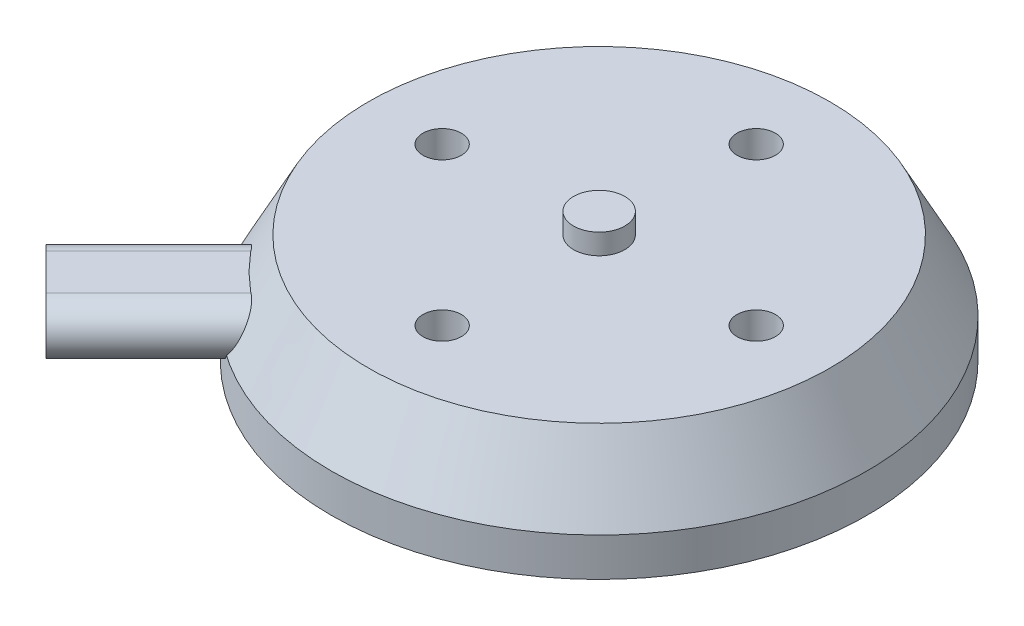
ISO-10303-21;
HEADER;
FILE_DESCRIPTION(('STEP AP214'),'2;1');
FILE_NAME('part.step','',(''),(''),'','','');
FILE_SCHEMA(('AUTOMOTIVE_DESIGN { 1 0 10303 214 1 1 1 1 }'));
ENDSEC;
DATA;
#1=APPLICATION_CONTEXT('core data for automotive mechanical design processes');
#2=APPLICATION_PROTOCOL_DEFINITION('international standard','automotive_design',2000,#1);
#3=PRODUCT_CONTEXT('',#1,'mechanical');
#4=PRODUCT('Part','Part','',(#3));
#5=PRODUCT_RELATED_PRODUCT_CATEGORY('part','',(#4));
#6=PRODUCT_DEFINITION_FORMATION('','',#4);
#7=PRODUCT_DEFINITION_CONTEXT('part definition',#1,'design');
#8=PRODUCT_DEFINITION('design','',#6,#7);
#9=PRODUCT_DEFINITION_SHAPE('','',#8);
#10=(LENGTH_UNIT() NAMED_UNIT(*) SI_UNIT(.MILLI.,.METRE.));
#11=(NAMED_UNIT(*) PLANE_ANGLE_UNIT() SI_UNIT($,.RADIAN.));
#12=(NAMED_UNIT(*) SI_UNIT($,.STERADIAN.) SOLID_ANGLE_UNIT());
#13=UNCERTAINTY_MEASURE_WITH_UNIT(LENGTH_MEASURE(1.E-05),#10,'distance_accuracy_value','');
#14=(GEOMETRIC_REPRESENTATION_CONTEXT(3) GLOBAL_UNCERTAINTY_ASSIGNED_CONTEXT((#13)) GLOBAL_UNIT_ASSIGNED_CONTEXT((#10,
#11,#12)) REPRESENTATION_CONTEXT('',''));
#15=CARTESIAN_POINT('',(0.,0.,0.));
#16=DIRECTION('',(0.,0.,1.));
#17=DIRECTION('',(1.,0.,0.));
#18=AXIS2_PLACEMENT_3D('',#15,#16,#17);
#19=CARTESIAN_POINT('',(-1.4142135623731,4.,-1.41421356237309));
#20=DIRECTION('',(-0.707106781186544,0.,0.707106781186551));
#21=DIRECTION('',(0.707106781186551,0.,0.707106781186544));
#22=AXIS2_PLACEMENT_3D('',#19,#20,#21);
#23=CYLINDRICAL_SURFACE('',#22,2.);
#24=DIRECTION('',(-0.707106781186544,0.,0.707106781186551));
#25=VECTOR('',#24,1.);
#26=CARTESIAN_POINT('',(-1.41421356237311,6.,-1.41421356237309));
#27=LINE('',#26,#25);
#28=CARTESIAN_POINT('',(-1.4142135623731,6.,-1.41421356237309));
#29=VERTEX_POINT('',#28);
#30=CARTESIAN_POINT('',(-22.9906252171124,6.,20.1621980923664));
#31=VERTEX_POINT('',#30);
#32=EDGE_CURVE('E101',#29,#31,#27,.T.);
#33=ORIENTED_EDGE('',*,*,#32,.F.);
#34=CARTESIAN_POINT('',(-1.4142135623731,4.,-1.41421356237309));
#35=DIRECTION('',(0.707106781186544,0.,-0.707106781186551));
#36=DIRECTION('',(-0.707106781186551,0.,-0.707106781186544));
#37=AXIS2_PLACEMENT_3D('',#34,#35,#36);
#38=CIRCLE('',#37,2.);
#39=CARTESIAN_POINT('',(-1.4142135623731,2.,-1.41421356237309));
#40=VERTEX_POINT('',#39);
#41=EDGE_CURVE('E53',#40,#29,#38,.T.);
#42=ORIENTED_EDGE('',*,*,#41,.F.);
#43=DIRECTION('',(0.707106781186544,0.,-0.707106781186551));
#44=VECTOR('',#43,1.);
#45=CARTESIAN_POINT('',(-1.4142135623731,2.,-1.41421356237309));
#46=LINE('',#45,#44);
#47=CARTESIAN_POINT('',(-22.9906252171124,2.,20.1621980923664));
#48=VERTEX_POINT('',#47);
#49=EDGE_CURVE('E114',#48,#40,#46,.T.);
#50=ORIENTED_EDGE('',*,*,#49,.F.);
#51=CARTESIAN_POINT('',(-22.9906252171124,4.,20.1621980923664));
#52=DIRECTION('',(0.707106781186544,0.,-0.707106781186552));
#53=DIRECTION('',(-0.707106781186551,0.,-0.707106781186544));
#54=AXIS2_PLACEMENT_3D('',#51,#52,#53);
#55=CIRCLE('',#54,2.);
#56=EDGE_CURVE('E12',#31,#48,#55,.F.);
#57=ORIENTED_EDGE('',*,*,#56,.F.);
#58=EDGE_LOOP('',(#33,#42,#50,#57));
#59=FACE_BOUND('',#58,.T.);
#60=ADVANCED_FACE('F45',(#59),#23,.T.);
#61=CARTESIAN_POINT('',(-20.1621980923662,4.,22.9906252171126));
#62=DIRECTION('',(0.707106781186544,0.,-0.707106781186551));
#63=DIRECTION('',(-0.707106781186551,0.,-0.707106781186544));
#64=AXIS2_PLACEMENT_3D('',#61,#62,#63);
#65=CYLINDRICAL_SURFACE('',#64,2.);
#66=DIRECTION('',(0.707106781186544,0.,-0.707106781186551));
#67=VECTOR('',#66,1.);
#68=CARTESIAN_POINT('',(1.41421356237312,6.,1.4142135623731));
#69=LINE('',#68,#67);
#70=CARTESIAN_POINT('',(-20.1621980923662,6.,22.9906252171126));
#71=VERTEX_POINT('',#70);
#72=CARTESIAN_POINT('',(1.41421356237312,6.,1.4142135623731));
#73=VERTEX_POINT('',#72);
#74=EDGE_CURVE('E92',#71,#73,#69,.T.);
#75=ORIENTED_EDGE('',*,*,#74,.F.);
#76=CARTESIAN_POINT('',(-20.1621980923662,4.,22.9906252171126));
#77=DIRECTION('',(0.707106781186544,0.,-0.707106781186552));
#78=DIRECTION('',(-0.707106781186551,0.,-0.707106781186544));
#79=AXIS2_PLACEMENT_3D('',#76,#77,#78);
#80=CIRCLE('',#79,2.);
#81=CARTESIAN_POINT('',(-20.1621980923662,2.,22.9906252171126));
#82=VERTEX_POINT('',#81);
#83=EDGE_CURVE('E102',#82,#71,#80,.F.);
#84=ORIENTED_EDGE('',*,*,#83,.F.);
#85=DIRECTION('',(-0.707106781186544,0.,0.707106781186551));
#86=VECTOR('',#85,1.);
#87=CARTESIAN_POINT('',(-20.1621980923662,2.,22.9906252171126));
#88=LINE('',#87,#86);
#89=CARTESIAN_POINT('',(1.41421356237312,2.,1.4142135623731));
#90=VERTEX_POINT('',#89);
#91=EDGE_CURVE('E100',#90,#82,#88,.T.);
#92=ORIENTED_EDGE('',*,*,#91,.F.);
#93=CARTESIAN_POINT('',(1.41421356237312,4.,1.4142135623731));
#94=DIRECTION('',(0.707106781186544,0.,-0.707106781186551));
#95=DIRECTION('',(-0.707106781186551,0.,-0.707106781186544));
#96=AXIS2_PLACEMENT_3D('',#93,#94,#95);
#97=CIRCLE('',#96,2.);
#98=EDGE_CURVE('E87',#73,#90,#97,.T.);
#99=ORIENTED_EDGE('',*,*,#98,.F.);
#100=EDGE_LOOP('',(#75,#84,#92,#99));
#101=FACE_BOUND('',#100,.T.);
#102=ADVANCED_FACE('F97',(#101),#65,.T.);
#103=CARTESIAN_POINT('',(0.,6.,0.));
#104=DIRECTION('',(0.707106781186544,0.,-0.707106781186551));
#105=DIRECTION('',(-0.707106781186551,0.,-0.707106781186544));
#106=AXIS2_PLACEMENT_3D('',#103,#104,#105);
#107=PLANE('',#106);
#108=DIRECTION('',(0.707106781186551,0.,0.707106781186544));
#109=VECTOR('',#108,1.);
#110=CARTESIAN_POINT('',(0.,2.,0.));
#111=LINE('',#110,#109);
#112=EDGE_CURVE('E109',#40,#90,#111,.T.);
#113=ORIENTED_EDGE('',*,*,#112,.F.);
#114=ORIENTED_EDGE('',*,*,#41,.T.);
#115=DIRECTION('',(0.707106781186551,0.,0.707106781186544));
#116=VECTOR('',#115,1.);
#117=CARTESIAN_POINT('',(0.,6.,0.));
#118=LINE('',#117,#116);
#119=EDGE_CURVE('E83',#29,#73,#118,.T.);
#120=ORIENTED_EDGE('',*,*,#119,.T.);
#121=ORIENTED_EDGE('',*,*,#98,.T.);
#122=EDGE_LOOP('',(#113,#114,#120,#121));
#123=FACE_BOUND('',#122,.T.);
#124=ADVANCED_FACE('F86',(#123),#107,.T.);
#125=CARTESIAN_POINT('',(-21.5764116547393,6.,21.5764116547395));
#126=DIRECTION('',(0.707106781186544,0.,-0.707106781186552));
#127=DIRECTION('',(-0.707106781186551,0.,-0.707106781186544));
#128=AXIS2_PLACEMENT_3D('',#125,#126,#127);
#129=PLANE('',#128);
#130=DIRECTION('',(0.707106781186551,0.,0.707106781186544));
#131=VECTOR('',#130,1.);
#132=CARTESIAN_POINT('',(-21.5764116547393,6.,21.5764116547395));
#133=LINE('',#132,#131);
#134=EDGE_CURVE('E93',#31,#71,#133,.T.);
#135=ORIENTED_EDGE('',*,*,#134,.F.);
#136=ORIENTED_EDGE('',*,*,#56,.T.);
#137=DIRECTION('',(0.707106781186551,0.,0.707106781186544));
#138=VECTOR('',#137,1.);
#139=CARTESIAN_POINT('',(-21.5764116547393,2.,21.5764116547395));
#140=LINE('',#139,#138);
#141=EDGE_CURVE('E118',#48,#82,#140,.T.);
#142=ORIENTED_EDGE('',*,*,#141,.T.);
#143=ORIENTED_EDGE('',*,*,#83,.T.);
#144=EDGE_LOOP('',(#135,#136,#142,#143));
#145=FACE_BOUND('',#144,.T.);
#146=ADVANCED_FACE('F120',(#145),#129,.F.);
#147=CARTESIAN_POINT('',(0.,6.,0.));
#148=DIRECTION('',(0.,-1.,0.));
#149=DIRECTION('',(0.,0.,-1.));
#150=AXIS2_PLACEMENT_3D('',#147,#148,#149);
#151=PLANE('',#150);
#152=ORIENTED_EDGE('',*,*,#119,.F.);
#153=ORIENTED_EDGE('',*,*,#32,.T.);
#154=ORIENTED_EDGE('',*,*,#134,.T.);
#155=ORIENTED_EDGE('',*,*,#74,.T.);
#156=EDGE_LOOP('',(#152,#153,#154,#155));
#157=FACE_BOUND('',#156,.T.);
#158=ADVANCED_FACE('F104',(#157),#151,.F.);
#159=CARTESIAN_POINT('',(0.,2.,0.));
#160=DIRECTION('',(0.,-1.,0.));
#161=DIRECTION('',(0.,0.,-1.));
#162=AXIS2_PLACEMENT_3D('',#159,#160,#161);
#163=PLANE('',#162);
#164=ORIENTED_EDGE('',*,*,#141,.F.);
#165=ORIENTED_EDGE('',*,*,#49,.T.);
#166=ORIENTED_EDGE('',*,*,#112,.T.);
#167=ORIENTED_EDGE('',*,*,#91,.T.);
#168=EDGE_LOOP('',(#164,#165,#166,#167));
#169=FACE_BOUND('',#168,.T.);
#170=ADVANCED_FACE('F117',(#169),#163,.T.);
#171=CLOSED_SHELL('',(#60,#102,#124,#146,#158,#170));
#172=MANIFOLD_SOLID_BREP('B2',#171);
#173=CARTESIAN_POINT('',(0.,10.1,0.));
#174=DIRECTION('',(0.,-1.,0.));
#175=DIRECTION('',(0.,0.,-1.));
#176=AXIS2_PLACEMENT_3D('',#173,#174,#175);
#177=CYLINDRICAL_SURFACE('',#176,2.);
#178=CARTESIAN_POINT('',(0.,10.1,0.));
#179=DIRECTION('',(0.,1.,0.));
#180=DIRECTION('',(0.,0.,1.));
#181=AXIS2_PLACEMENT_3D('',#178,#179,#180);
#182=CIRCLE('',#181,2.);
#183=CARTESIAN_POINT('',(0.,10.1,2.));
#184=VERTEX_POINT('',#183);
#185=EDGE_CURVE('E44',#184,#184,#182,.T.);
#186=ORIENTED_EDGE('',*,*,#185,.F.);
#187=EDGE_LOOP('',(#186));
#188=FACE_BOUND('',#187,.T.);
#189=CARTESIAN_POINT('',(0.,8.5,0.));
#190=DIRECTION('',(0.,1.,0.));
#191=DIRECTION('',(0.,0.,1.));
#192=AXIS2_PLACEMENT_3D('',#189,#190,#191);
#193=CIRCLE('',#192,2.);
#194=CARTESIAN_POINT('',(0.,8.5,2.));
#195=VERTEX_POINT('',#194);
#196=EDGE_CURVE('E199',#195,#195,#193,.T.);
#197=ORIENTED_EDGE('',*,*,#196,.T.);
#198=EDGE_LOOP('',(#197));
#199=FACE_BOUND('',#198,.T.);
#200=ADVANCED_FACE('F196',(#188,#199),#177,.T.);
#201=CARTESIAN_POINT('',(0.,10.1,0.));
#202=DIRECTION('',(0.,1.,0.));
#203=DIRECTION('',(0.,0.,1.));
#204=AXIS2_PLACEMENT_3D('',#201,#202,#203);
#205=PLANE('',#204);
#206=ORIENTED_EDGE('',*,*,#185,.T.);
#207=EDGE_LOOP('',(#206));
#208=FACE_BOUND('',#207,.T.);
#209=ADVANCED_FACE('F211',(#208),#205,.T.);
#210=CARTESIAN_POINT('',(0.,8.5,0.));
#211=DIRECTION('',(0.,1.,0.));
#212=DIRECTION('',(0.,0.,1.));
#213=AXIS2_PLACEMENT_3D('',#210,#211,#212);
#214=PLANE('',#213);
#215=ORIENTED_EDGE('',*,*,#196,.F.);
#216=EDGE_LOOP('',(#215));
#217=FACE_BOUND('',#216,.T.);
#218=ADVANCED_FACE('F209',(#217),#214,.F.);
#219=CLOSED_SHELL('',(#200,#209,#218));
#220=MANIFOLD_SOLID_BREP('B6',#219);
#221=CARTESIAN_POINT('',(-18.,8.5,0.));
#222=DIRECTION('',(0.,-1.,0.));
#223=DIRECTION('',(0.,0.,-1.));
#224=AXIS2_PLACEMENT_3D('',#221,#222,#223);
#225=PLANE('',#224);
#226=CARTESIAN_POINT('',(-1.31838984174237E-13,8.5,-12.25));
#227=DIRECTION('',(0.,1.,0.));
#228=DIRECTION('',(0.,0.,-1.));
#229=AXIS2_PLACEMENT_3D('',#226,#227,#228);
#230=CIRCLE('',#229,1.5);
#231=CARTESIAN_POINT('',(-1.31838984174237E-13,8.5,-13.75));
#232=VERTEX_POINT('',#231);
#233=EDGE_CURVE('E273',#232,#232,#230,.T.);
#234=ORIENTED_EDGE('',*,*,#233,.F.);
#235=EDGE_LOOP('',(#234));
#236=FACE_BOUND('',#235,.T.);
#237=CARTESIAN_POINT('',(1.33573707650214E-13,8.5,12.25));
#238=DIRECTION('',(0.,1.,0.));
#239=DIRECTION('',(0.,0.,-1.));
#240=AXIS2_PLACEMENT_3D('',#237,#238,#239);
#241=CIRCLE('',#240,1.5);
#242=CARTESIAN_POINT('',(1.33573707650214E-13,8.5,10.75));
#243=VERTEX_POINT('',#242);
#244=EDGE_CURVE('E267',#243,#243,#241,.T.);
#245=ORIENTED_EDGE('',*,*,#244,.F.);
#246=EDGE_LOOP('',(#245));
#247=FACE_BOUND('',#246,.T.);
#248=CARTESIAN_POINT('',(-12.25,8.5,0.));
#249=DIRECTION('',(0.,1.,0.));
#250=DIRECTION('',(0.,0.,1.));
#251=AXIS2_PLACEMENT_3D('',#248,#249,#250);
#252=CIRCLE('',#251,1.5);
#253=CARTESIAN_POINT('',(-12.25,8.5,1.5));
#254=VERTEX_POINT('',#253);
#255=EDGE_CURVE('E261',#254,#254,#252,.T.);
#256=ORIENTED_EDGE('',*,*,#255,.F.);
#257=EDGE_LOOP('',(#256));
#258=FACE_BOUND('',#257,.T.);
#259=CARTESIAN_POINT('',(12.25,8.5,0.));
#260=DIRECTION('',(0.,1.,0.));
#261=DIRECTION('',(0.,0.,1.));
#262=AXIS2_PLACEMENT_3D('',#259,#260,#261);
#263=CIRCLE('',#262,1.5);
#264=CARTESIAN_POINT('',(12.25,8.5,1.5));
#265=VERTEX_POINT('',#264);
#266=EDGE_CURVE('E255',#265,#265,#263,.T.);
#267=ORIENTED_EDGE('',*,*,#266,.F.);
#268=EDGE_LOOP('',(#267));
#269=FACE_BOUND('',#268,.T.);
#270=CARTESIAN_POINT('',(0.,8.5,0.));
#271=DIRECTION('',(0.,-1.,0.));
#272=DIRECTION('',(0.,0.,-1.));
#273=AXIS2_PLACEMENT_3D('',#270,#271,#272);
#274=CIRCLE('',#273,18.);
#275=CARTESIAN_POINT('',(0.,8.5,-18.));
#276=VERTEX_POINT('',#275);
#277=EDGE_CURVE('E195',#276,#276,#274,.T.);
#278=ORIENTED_EDGE('',*,*,#277,.F.);
#279=EDGE_LOOP('',(#278));
#280=FACE_BOUND('',#279,.T.);
#281=ADVANCED_FACE('F236',(#236,#247,#258,#269,#280),#225,.F.);
#282=CARTESIAN_POINT('',(0.,8.5,0.));
#283=DIRECTION('',(0.,-1.,0.));
#284=DIRECTION('',(0.,0.,-1.));
#285=AXIS2_PLACEMENT_3D('',#282,#283,#284);
#286=CONICAL_SURFACE('',#285,18.,0.485226992567336);
#287=CARTESIAN_POINT('',(0.,3.,0.));
#288=DIRECTION('',(0.,-1.,0.));
#289=DIRECTION('',(0.,0.,-1.));
#290=AXIS2_PLACEMENT_3D('',#287,#288,#289);
#291=CIRCLE('',#290,20.9);
#292=CARTESIAN_POINT('',(0.,3.,-20.9));
#293=VERTEX_POINT('',#292);
#294=EDGE_CURVE('E242',#293,#293,#291,.T.);
#295=ORIENTED_EDGE('',*,*,#294,.F.);
#296=EDGE_LOOP('',(#295));
#297=FACE_BOUND('',#296,.T.);
#298=ORIENTED_EDGE('',*,*,#277,.T.);
#299=EDGE_LOOP('',(#298));
#300=FACE_BOUND('',#299,.T.);
#301=ADVANCED_FACE('F282',(#297,#300),#286,.T.);
#302=CARTESIAN_POINT('',(0.,0.,0.));
#303=DIRECTION('',(0.,-1.,0.));
#304=DIRECTION('',(0.,0.,-1.));
#305=AXIS2_PLACEMENT_3D('',#302,#303,#304);
#306=CYLINDRICAL_SURFACE('',#305,20.9);
#307=CARTESIAN_POINT('',(0.,0.,0.));
#308=DIRECTION('',(0.,-1.,0.));
#309=DIRECTION('',(0.,0.,-1.));
#310=AXIS2_PLACEMENT_3D('',#307,#308,#309);
#311=CIRCLE('',#310,20.9);
#312=CARTESIAN_POINT('',(0.,0.,-20.9));
#313=VERTEX_POINT('',#312);
#314=EDGE_CURVE('E246',#313,#313,#311,.T.);
#315=ORIENTED_EDGE('',*,*,#314,.F.);
#316=EDGE_LOOP('',(#315));
#317=FACE_BOUND('',#316,.T.);
#318=ORIENTED_EDGE('',*,*,#294,.T.);
#319=EDGE_LOOP('',(#318));
#320=FACE_BOUND('',#319,.T.);
#321=ADVANCED_FACE('F300',(#317,#320),#306,.T.);
#322=CARTESIAN_POINT('',(-20.9,0.,0.));
#323=DIRECTION('',(0.,1.,0.));
#324=DIRECTION('',(0.,0.,1.));
#325=AXIS2_PLACEMENT_3D('',#322,#323,#324);
#326=PLANE('',#325);
#327=CARTESIAN_POINT('',(-1.31838984174237E-13,0.,-12.25));
#328=DIRECTION('',(0.,1.,0.));
#329=DIRECTION('',(0.,0.,1.));
#330=AXIS2_PLACEMENT_3D('',#327,#328,#329);
#331=CIRCLE('',#330,1.5);
#332=CARTESIAN_POINT('',(-1.31838984174237E-13,0.,-10.75));
#333=VERTEX_POINT('',#332);
#334=EDGE_CURVE('E270',#333,#333,#331,.F.);
#335=ORIENTED_EDGE('',*,*,#334,.F.);
#336=EDGE_LOOP('',(#335));
#337=FACE_BOUND('',#336,.T.);
#338=CARTESIAN_POINT('',(1.33573707650214E-13,0.,12.25));
#339=DIRECTION('',(0.,1.,0.));
#340=DIRECTION('',(0.,0.,1.));
#341=AXIS2_PLACEMENT_3D('',#338,#339,#340);
#342=CIRCLE('',#341,1.5);
#343=CARTESIAN_POINT('',(1.33573707650214E-13,0.,13.75));
#344=VERTEX_POINT('',#343);
#345=EDGE_CURVE('E264',#344,#344,#342,.F.);
#346=ORIENTED_EDGE('',*,*,#345,.F.);
#347=EDGE_LOOP('',(#346));
#348=FACE_BOUND('',#347,.T.);
#349=CARTESIAN_POINT('',(-12.25,0.,0.));
#350=DIRECTION('',(0.,1.,0.));
#351=DIRECTION('',(0.,0.,1.));
#352=AXIS2_PLACEMENT_3D('',#349,#350,#351);
#353=CIRCLE('',#352,1.5);
#354=CARTESIAN_POINT('',(-12.25,0.,1.5));
#355=VERTEX_POINT('',#354);
#356=EDGE_CURVE('E258',#355,#355,#353,.F.);
#357=ORIENTED_EDGE('',*,*,#356,.F.);
#358=EDGE_LOOP('',(#357));
#359=FACE_BOUND('',#358,.T.);
#360=CARTESIAN_POINT('',(12.25,0.,0.));
#361=DIRECTION('',(0.,1.,0.));
#362=DIRECTION('',(0.,0.,1.));
#363=AXIS2_PLACEMENT_3D('',#360,#361,#362);
#364=CIRCLE('',#363,1.5);
#365=CARTESIAN_POINT('',(12.25,0.,1.5));
#366=VERTEX_POINT('',#365);
#367=EDGE_CURVE('E250',#366,#366,#364,.F.);
#368=ORIENTED_EDGE('',*,*,#367,.F.);
#369=EDGE_LOOP('',(#368));
#370=FACE_BOUND('',#369,.T.);
#371=ORIENTED_EDGE('',*,*,#314,.T.);
#372=EDGE_LOOP('',(#371));
#373=FACE_BOUND('',#372,.T.);
#374=ADVANCED_FACE('F294',(#337,#348,#359,#370,#373),#326,.F.);
#375=CARTESIAN_POINT('',(12.25,-0.000999999999999265,0.));
#376=DIRECTION('',(0.,1.,0.));
#377=DIRECTION('',(0.,0.,1.));
#378=AXIS2_PLACEMENT_3D('',#375,#376,#377);
#379=CYLINDRICAL_SURFACE('',#378,1.5);
#380=ORIENTED_EDGE('',*,*,#266,.T.);
#381=EDGE_LOOP('',(#380));
#382=FACE_BOUND('',#381,.T.);
#383=ORIENTED_EDGE('',*,*,#367,.T.);
#384=EDGE_LOOP('',(#383));
#385=FACE_BOUND('',#384,.T.);
#386=ADVANCED_FACE('F290',(#382,#385),#379,.F.);
#387=CARTESIAN_POINT('',(-12.25,-0.000999999999999265,0.));
#388=DIRECTION('',(0.,1.,0.));
#389=DIRECTION('',(0.,0.,1.));
#390=AXIS2_PLACEMENT_3D('',#387,#388,#389);
#391=CYLINDRICAL_SURFACE('',#390,1.5);
#392=ORIENTED_EDGE('',*,*,#255,.T.);
#393=EDGE_LOOP('',(#392));
#394=FACE_BOUND('',#393,.T.);
#395=ORIENTED_EDGE('',*,*,#356,.T.);
#396=EDGE_LOOP('',(#395));
#397=FACE_BOUND('',#396,.T.);
#398=ADVANCED_FACE('F293',(#394,#397),#391,.F.);
#399=CARTESIAN_POINT('',(1.33573707650214E-13,-0.000999999999999265,12.25));
#400=DIRECTION('',(0.,1.,0.));
#401=DIRECTION('',(0.,0.,1.));
#402=AXIS2_PLACEMENT_3D('',#399,#400,#401);
#403=CYLINDRICAL_SURFACE('',#402,1.5);
#404=ORIENTED_EDGE('',*,*,#244,.T.);
#405=EDGE_LOOP('',(#404));
#406=FACE_BOUND('',#405,.T.);
#407=ORIENTED_EDGE('',*,*,#345,.T.);
#408=EDGE_LOOP('',(#407));
#409=FACE_BOUND('',#408,.T.);
#410=ADVANCED_FACE('F314',(#406,#409),#403,.F.);
#411=CARTESIAN_POINT('',(-1.31838984174237E-13,-0.000999999999999265,-12.25));
#412=DIRECTION('',(0.,1.,0.));
#413=DIRECTION('',(0.,0.,1.));
#414=AXIS2_PLACEMENT_3D('',#411,#412,#413);
#415=CYLINDRICAL_SURFACE('',#414,1.5);
#416=ORIENTED_EDGE('',*,*,#233,.T.);
#417=EDGE_LOOP('',(#416));
#418=FACE_BOUND('',#417,.T.);
#419=ORIENTED_EDGE('',*,*,#334,.T.);
#420=EDGE_LOOP('',(#419));
#421=FACE_BOUND('',#420,.T.);
#422=ADVANCED_FACE('F277',(#418,#421),#415,.F.);
#423=CLOSED_SHELL('',(#281,#301,#321,#374,#386,#398,#410,#422));
#424=MANIFOLD_SOLID_BREP('B39',#423);
#425=ADVANCED_BREP_SHAPE_REPRESENTATION('',(#18,#172,#220,#424),#14);
#426=SHAPE_DEFINITION_REPRESENTATION(#9,#425);
ENDSEC;
END-ISO-10303-21;
